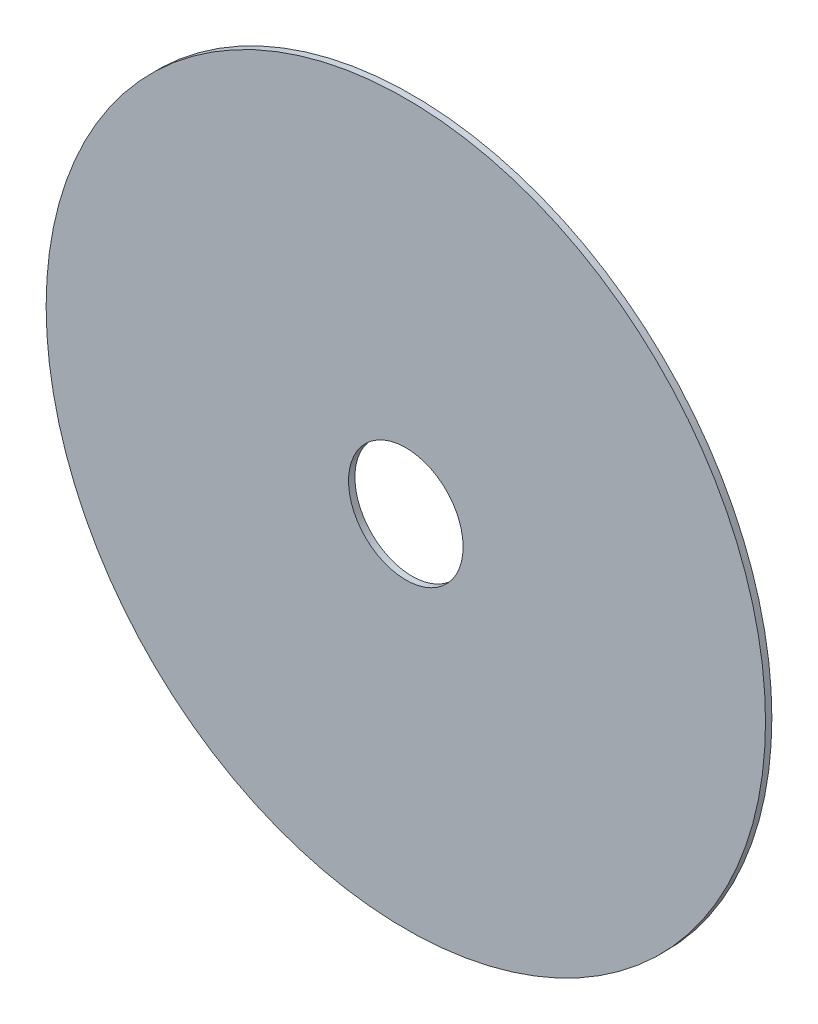
ISO-10303-21;
HEADER;
FILE_DESCRIPTION(('STEP AP214'),'2;1');
FILE_NAME('part.step','',(''),(''),'','','');
FILE_SCHEMA(('AUTOMOTIVE_DESIGN { 1 0 10303 214 1 1 1 1 }'));
ENDSEC;
DATA;
#1=APPLICATION_CONTEXT('core data for automotive mechanical design processes');
#2=APPLICATION_PROTOCOL_DEFINITION('international standard','automotive_design',2000,#1);
#3=PRODUCT_CONTEXT('',#1,'mechanical');
#4=PRODUCT('Part','Part','',(#3));
#5=PRODUCT_RELATED_PRODUCT_CATEGORY('part','',(#4));
#6=PRODUCT_DEFINITION_FORMATION('','',#4);
#7=PRODUCT_DEFINITION_CONTEXT('part definition',#1,'design');
#8=PRODUCT_DEFINITION('design','',#6,#7);
#9=PRODUCT_DEFINITION_SHAPE('','',#8);
#10=(LENGTH_UNIT() NAMED_UNIT(*) SI_UNIT(.MILLI.,.METRE.));
#11=(NAMED_UNIT(*) PLANE_ANGLE_UNIT() SI_UNIT($,.RADIAN.));
#12=(NAMED_UNIT(*) SI_UNIT($,.STERADIAN.) SOLID_ANGLE_UNIT());
#13=UNCERTAINTY_MEASURE_WITH_UNIT(LENGTH_MEASURE(1.E-05),#10,'distance_accuracy_value','');
#14=(GEOMETRIC_REPRESENTATION_CONTEXT(3) GLOBAL_UNCERTAINTY_ASSIGNED_CONTEXT((#13)) GLOBAL_UNIT_ASSIGNED_CONTEXT((#10,
#11,#12)) REPRESENTATION_CONTEXT('',''));
#15=CARTESIAN_POINT('',(0.,0.,0.));
#16=DIRECTION('',(0.,0.,1.));
#17=DIRECTION('',(1.,0.,0.));
#18=AXIS2_PLACEMENT_3D('',#15,#16,#17);
#19=CARTESIAN_POINT('',(0.,0.,5.));
#20=DIRECTION('',(0.,0.,1.));
#21=DIRECTION('',(1.,0.,0.));
#22=AXIS2_PLACEMENT_3D('',#19,#20,#21);
#23=PLANE('',#22);
#24=CARTESIAN_POINT('',(0.,0.,5.));
#25=DIRECTION('',(0.,0.,1.));
#26=DIRECTION('',(1.,0.,0.));
#27=AXIS2_PLACEMENT_3D('',#24,#25,#26);
#28=CIRCLE('',#27,282.5);
#29=CARTESIAN_POINT('',(282.5,0.,5.));
#30=VERTEX_POINT('',#29);
#31=EDGE_CURVE('E10',#30,#30,#28,.T.);
#32=ORIENTED_EDGE('',*,*,#31,.T.);
#33=EDGE_LOOP('',(#32));
#34=FACE_BOUND('',#33,.T.);
#35=CARTESIAN_POINT('',(0.,0.,5.));
#36=DIRECTION('',(0.,0.,1.));
#37=DIRECTION('',(1.,0.,0.));
#38=AXIS2_PLACEMENT_3D('',#35,#36,#37);
#39=CIRCLE('',#38,45.);
#40=CARTESIAN_POINT('',(45.,0.,5.));
#41=VERTEX_POINT('',#40);
#42=EDGE_CURVE('E44',#41,#41,#39,.T.);
#43=ORIENTED_EDGE('',*,*,#42,.F.);
#44=EDGE_LOOP('',(#43));
#45=FACE_BOUND('',#44,.T.);
#46=ADVANCED_FACE('F33',(#34,#45),#23,.T.);
#47=CARTESIAN_POINT('',(0.,0.,0.));
#48=DIRECTION('',(0.,0.,1.));
#49=DIRECTION('',(1.,0.,0.));
#50=AXIS2_PLACEMENT_3D('',#47,#48,#49);
#51=PLANE('',#50);
#52=CARTESIAN_POINT('',(0.,0.,0.));
#53=DIRECTION('',(0.,0.,1.));
#54=DIRECTION('',(1.,0.,0.));
#55=AXIS2_PLACEMENT_3D('',#52,#53,#54);
#56=CIRCLE('',#55,282.5);
#57=CARTESIAN_POINT('',(282.5,0.,0.));
#58=VERTEX_POINT('',#57);
#59=EDGE_CURVE('E37',#58,#58,#56,.T.);
#60=ORIENTED_EDGE('',*,*,#59,.F.);
#61=EDGE_LOOP('',(#60));
#62=FACE_BOUND('',#61,.T.);
#63=CARTESIAN_POINT('',(0.,0.,0.));
#64=DIRECTION('',(0.,0.,1.));
#65=DIRECTION('',(1.,0.,0.));
#66=AXIS2_PLACEMENT_3D('',#63,#64,#65);
#67=CIRCLE('',#66,45.);
#68=CARTESIAN_POINT('',(45.,0.,0.));
#69=VERTEX_POINT('',#68);
#70=EDGE_CURVE('E46',#69,#69,#67,.T.);
#71=ORIENTED_EDGE('',*,*,#70,.T.);
#72=EDGE_LOOP('',(#71));
#73=FACE_BOUND('',#72,.T.);
#74=ADVANCED_FACE('F56',(#62,#73),#51,.F.);
#75=CARTESIAN_POINT('',(0.,0.,5.));
#76=DIRECTION('',(0.,0.,-1.));
#77=DIRECTION('',(-1.,0.,0.));
#78=AXIS2_PLACEMENT_3D('',#75,#76,#77);
#79=CYLINDRICAL_SURFACE('',#78,282.5);
#80=ORIENTED_EDGE('',*,*,#31,.F.);
#81=EDGE_LOOP('',(#80));
#82=FACE_BOUND('',#81,.T.);
#83=ORIENTED_EDGE('',*,*,#59,.T.);
#84=EDGE_LOOP('',(#83));
#85=FACE_BOUND('',#84,.T.);
#86=ADVANCED_FACE('F35',(#82,#85),#79,.T.);
#87=CARTESIAN_POINT('',(0.,0.,5.));
#88=DIRECTION('',(0.,0.,-1.));
#89=DIRECTION('',(-1.,0.,0.));
#90=AXIS2_PLACEMENT_3D('',#87,#88,#89);
#91=CYLINDRICAL_SURFACE('',#90,45.);
#92=ORIENTED_EDGE('',*,*,#42,.T.);
#93=EDGE_LOOP('',(#92));
#94=FACE_BOUND('',#93,.T.);
#95=ORIENTED_EDGE('',*,*,#70,.F.);
#96=EDGE_LOOP('',(#95));
#97=FACE_BOUND('',#96,.T.);
#98=ADVANCED_FACE('F52',(#94,#97),#91,.F.);
#99=CLOSED_SHELL('',(#46,#74,#86,#98));
#100=MANIFOLD_SOLID_BREP('B2',#99);
#101=ADVANCED_BREP_SHAPE_REPRESENTATION('',(#18,#100),#14);
#102=SHAPE_DEFINITION_REPRESENTATION(#9,#101);
ENDSEC;
END-ISO-10303-21;
